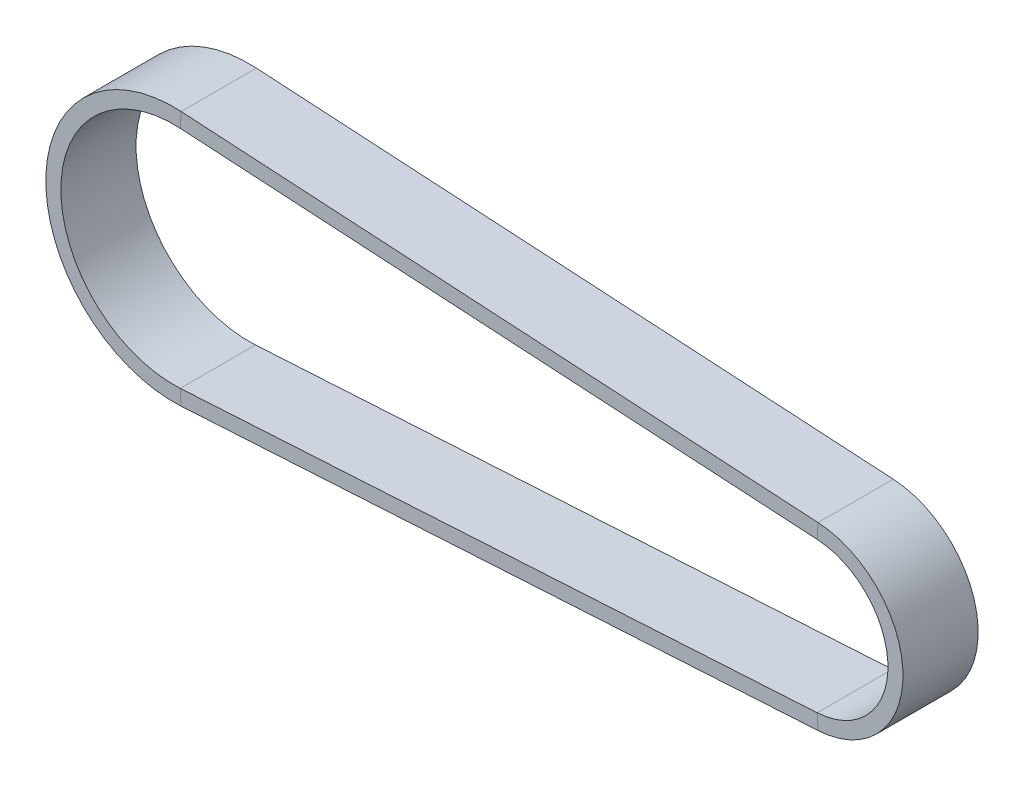
ISO-10303-21;
HEADER;
FILE_DESCRIPTION(('STEP AP214'),'2;1');
FILE_NAME('part.step','',(''),(''),'','','');
FILE_SCHEMA(('AUTOMOTIVE_DESIGN { 1 0 10303 214 1 1 1 1 }'));
ENDSEC;
DATA;
#1=APPLICATION_CONTEXT('core data for automotive mechanical design processes');
#2=APPLICATION_PROTOCOL_DEFINITION('international standard','automotive_design',2000,#1);
#3=PRODUCT_CONTEXT('',#1,'mechanical');
#4=PRODUCT('Part','Part','',(#3));
#5=PRODUCT_RELATED_PRODUCT_CATEGORY('part','',(#4));
#6=PRODUCT_DEFINITION_FORMATION('','',#4);
#7=PRODUCT_DEFINITION_CONTEXT('part definition',#1,'design');
#8=PRODUCT_DEFINITION('design','',#6,#7);
#9=PRODUCT_DEFINITION_SHAPE('','',#8);
#10=(LENGTH_UNIT() NAMED_UNIT(*) SI_UNIT(.MILLI.,.METRE.));
#11=(NAMED_UNIT(*) PLANE_ANGLE_UNIT() SI_UNIT($,.RADIAN.));
#12=(NAMED_UNIT(*) SI_UNIT($,.STERADIAN.) SOLID_ANGLE_UNIT());
#13=UNCERTAINTY_MEASURE_WITH_UNIT(LENGTH_MEASURE(1.E-05),#10,'distance_accuracy_value','');
#14=(GEOMETRIC_REPRESENTATION_CONTEXT(3) GLOBAL_UNCERTAINTY_ASSIGNED_CONTEXT((#13)) GLOBAL_UNIT_ASSIGNED_CONTEXT((#10,
#11,#12)) REPRESENTATION_CONTEXT('',''));
#15=CARTESIAN_POINT('',(0.,0.,0.));
#16=DIRECTION('',(0.,0.,1.));
#17=DIRECTION('',(1.,0.,0.));
#18=AXIS2_PLACEMENT_3D('',#15,#16,#17);
#19=CARTESIAN_POINT('',(85.,0.,15.5));
#20=DIRECTION('',(0.,0.,1.));
#21=DIRECTION('',(1.,0.,0.));
#22=AXIS2_PLACEMENT_3D('',#19,#20,#21);
#23=CYLINDRICAL_SURFACE('',#22,12.);
#24=CARTESIAN_POINT('',(85.,0.,20.5));
#25=DIRECTION('',(0.,0.,1.));
#26=DIRECTION('',(1.,0.,0.));
#27=AXIS2_PLACEMENT_3D('',#24,#25,#26);
#28=CIRCLE('',#27,12.);
#29=CARTESIAN_POINT('',(85.7058823529412,-11.9792207636309,20.5));
#30=VERTEX_POINT('',#29);
#31=CARTESIAN_POINT('',(85.7058823529412,11.9792207636309,20.5));
#32=VERTEX_POINT('',#31);
#33=EDGE_CURVE('E179',#30,#32,#28,.T.);
#34=ORIENTED_EDGE('',*,*,#33,.F.);
#35=DIRECTION('',(0.,0.,1.));
#36=VECTOR('',#35,1.);
#37=CARTESIAN_POINT('',(85.7058823529412,-11.9792207636309,10.5));
#38=LINE('',#37,#36);
#39=CARTESIAN_POINT('',(85.7058823529412,-11.9792207636309,10.5));
#40=VERTEX_POINT('',#39);
#41=EDGE_CURVE('E164',#40,#30,#38,.T.);
#42=ORIENTED_EDGE('',*,*,#41,.F.);
#43=CARTESIAN_POINT('',(85.,0.,10.5));
#44=DIRECTION('',(0.,0.,1.));
#45=DIRECTION('',(1.,0.,0.));
#46=AXIS2_PLACEMENT_3D('',#43,#44,#45);
#47=CIRCLE('',#46,12.);
#48=CARTESIAN_POINT('',(85.7058823529412,11.9792207636309,10.5));
#49=VERTEX_POINT('',#48);
#50=EDGE_CURVE('E142',#40,#49,#47,.T.);
#51=ORIENTED_EDGE('',*,*,#50,.T.);
#52=DIRECTION('',(0.,0.,1.));
#53=VECTOR('',#52,1.);
#54=CARTESIAN_POINT('',(85.7058823529412,11.9792207636309,10.5));
#55=LINE('',#54,#53);
#56=EDGE_CURVE('E154',#49,#32,#55,.T.);
#57=ORIENTED_EDGE('',*,*,#56,.T.);
#58=EDGE_LOOP('',(#34,#42,#51,#57));
#59=FACE_BOUND('',#58,.T.);
#60=ADVANCED_FACE('F47',(#59),#23,.T.);
#61=CARTESIAN_POINT('',(95.,0.,20.5));
#62=DIRECTION('',(0.,0.,-1.));
#63=DIRECTION('',(-1.,0.,0.));
#64=AXIS2_PLACEMENT_3D('',#61,#62,#63);
#65=PLANE('',#64);
#66=CARTESIAN_POINT('',(85.,0.,20.5));
#67=DIRECTION('',(0.,0.,1.));
#68=DIRECTION('',(1.,0.,0.));
#69=AXIS2_PLACEMENT_3D('',#66,#67,#68);
#70=CIRCLE('',#69,9.99999999999999);
#71=CARTESIAN_POINT('',(85.5882352941177,-9.98268396969243,20.5));
#72=VERTEX_POINT('',#71);
#73=CARTESIAN_POINT('',(85.5882352941177,9.98268396969243,20.5));
#74=VERTEX_POINT('',#73);
#75=EDGE_CURVE('E230',#72,#74,#70,.T.);
#76=ORIENTED_EDGE('',*,*,#75,.F.);
#77=DIRECTION('',(-0.0588235294117653,0.998268396969244,0.));
#78=VECTOR('',#77,1.);
#79=CARTESIAN_POINT('',(85.5882352941177,-9.98268396969243,20.5));
#80=LINE('',#79,#78);
#81=EDGE_CURVE('E182',#30,#72,#80,.T.);
#82=ORIENTED_EDGE('',*,*,#81,.F.);
#83=ORIENTED_EDGE('',*,*,#33,.T.);
#84=DIRECTION('',(-0.0588235294117653,-0.998268396969244,0.));
#85=VECTOR('',#84,1.);
#86=CARTESIAN_POINT('',(85.5882352941177,9.98268396969243,20.5));
#87=LINE('',#86,#85);
#88=EDGE_CURVE('E209',#32,#74,#87,.T.);
#89=ORIENTED_EDGE('',*,*,#88,.T.);
#90=EDGE_LOOP('',(#76,#82,#83,#89));
#91=FACE_BOUND('',#90,.T.);
#92=ADVANCED_FACE('F293',(#91),#65,.F.);
#93=CARTESIAN_POINT('',(85.,0.,15.5));
#94=DIRECTION('',(0.,0.,1.));
#95=DIRECTION('',(1.,0.,0.));
#96=AXIS2_PLACEMENT_3D('',#93,#94,#95);
#97=CYLINDRICAL_SURFACE('',#96,9.99999999999999);
#98=CARTESIAN_POINT('',(85.,0.,10.5));
#99=DIRECTION('',(0.,0.,1.));
#100=DIRECTION('',(1.,0.,0.));
#101=AXIS2_PLACEMENT_3D('',#98,#99,#100);
#102=CIRCLE('',#101,9.99999999999999);
#103=CARTESIAN_POINT('',(85.5882352941177,-9.98268396969243,10.5));
#104=VERTEX_POINT('',#103);
#105=CARTESIAN_POINT('',(85.5882352941177,9.98268396969243,10.5));
#106=VERTEX_POINT('',#105);
#107=EDGE_CURVE('E245',#104,#106,#102,.T.);
#108=ORIENTED_EDGE('',*,*,#107,.F.);
#109=DIRECTION('',(0.,0.,-1.));
#110=VECTOR('',#109,1.);
#111=CARTESIAN_POINT('',(85.5882352941177,-9.98268396969244,10.5));
#112=LINE('',#111,#110);
#113=EDGE_CURVE('E176',#72,#104,#112,.T.);
#114=ORIENTED_EDGE('',*,*,#113,.F.);
#115=ORIENTED_EDGE('',*,*,#75,.T.);
#116=DIRECTION('',(0.,0.,-1.));
#117=VECTOR('',#116,1.);
#118=CARTESIAN_POINT('',(85.5882352941177,9.98268396969244,10.5));
#119=LINE('',#118,#117);
#120=EDGE_CURVE('E234',#74,#106,#119,.T.);
#121=ORIENTED_EDGE('',*,*,#120,.T.);
#122=EDGE_LOOP('',(#108,#114,#115,#121));
#123=FACE_BOUND('',#122,.T.);
#124=ADVANCED_FACE('F269',(#123),#97,.F.);
#125=CARTESIAN_POINT('',(95.,0.,10.5));
#126=DIRECTION('',(0.,0.,1.));
#127=DIRECTION('',(1.,0.,0.));
#128=AXIS2_PLACEMENT_3D('',#125,#126,#127);
#129=PLANE('',#128);
#130=DIRECTION('',(0.0588235294117653,0.998268396969244,0.));
#131=VECTOR('',#130,1.);
#132=CARTESIAN_POINT('',(85.5882352941177,9.98268396969244,10.5));
#133=LINE('',#132,#131);
#134=EDGE_CURVE('E149',#106,#49,#133,.T.);
#135=ORIENTED_EDGE('',*,*,#134,.T.);
#136=ORIENTED_EDGE('',*,*,#50,.F.);
#137=DIRECTION('',(0.0588235294117653,-0.998268396969244,0.));
#138=VECTOR('',#137,1.);
#139=CARTESIAN_POINT('',(85.5882352941177,-9.98268396969244,10.5));
#140=LINE('',#139,#138);
#141=EDGE_CURVE('E147',#104,#40,#140,.T.);
#142=ORIENTED_EDGE('',*,*,#141,.F.);
#143=ORIENTED_EDGE('',*,*,#107,.T.);
#144=EDGE_LOOP('',(#135,#136,#142,#143));
#145=FACE_BOUND('',#144,.T.);
#146=ADVANCED_FACE('F144',(#145),#129,.F.);
#147=CARTESIAN_POINT('',(85.7058823529412,11.9792207636309,10.5));
#148=DIRECTION('',(-0.0588235294117647,-0.998268396969244,0.));
#149=DIRECTION('',(0.998268396969244,-0.0588235294117647,0.));
#150=AXIS2_PLACEMENT_3D('',#147,#148,#149);
#151=PLANE('',#150);
#152=DIRECTION('',(-0.998268396969244,0.0588235294117647,0.));
#153=VECTOR('',#152,1.);
#154=CARTESIAN_POINT('',(85.7058823529412,11.9792207636309,20.5));
#155=LINE('',#154,#153);
#156=CARTESIAN_POINT('',(1.00000000000001,16.9705627484771,20.5));
#157=VERTEX_POINT('',#156);
#158=EDGE_CURVE('E112',#32,#157,#155,.T.);
#159=ORIENTED_EDGE('',*,*,#158,.F.);
#160=ORIENTED_EDGE('',*,*,#56,.F.);
#161=DIRECTION('',(-0.998268396969244,0.0588235294117647,0.));
#162=VECTOR('',#161,1.);
#163=CARTESIAN_POINT('',(85.7058823529412,11.9792207636309,10.5));
#164=LINE('',#163,#162);
#165=CARTESIAN_POINT('',(1.00000000000001,16.9705627484771,10.5));
#166=VERTEX_POINT('',#165);
#167=EDGE_CURVE('E214',#49,#166,#164,.T.);
#168=ORIENTED_EDGE('',*,*,#167,.T.);
#169=DIRECTION('',(0.,0.,1.));
#170=VECTOR('',#169,1.);
#171=CARTESIAN_POINT('',(1.,16.9705627484771,10.5));
#172=LINE('',#171,#170);
#173=EDGE_CURVE('E211',#166,#157,#172,.T.);
#174=ORIENTED_EDGE('',*,*,#173,.T.);
#175=EDGE_LOOP('',(#159,#160,#168,#174));
#176=FACE_BOUND('',#175,.T.);
#177=ADVANCED_FACE('F260',(#176),#151,.F.);
#178=CARTESIAN_POINT('',(85.5882352941177,9.98268396969244,20.5));
#179=DIRECTION('',(0.,0.,-1.));
#180=DIRECTION('',(-1.,0.,0.));
#181=AXIS2_PLACEMENT_3D('',#178,#179,#180);
#182=PLANE('',#181);
#183=DIRECTION('',(-0.998268396969244,0.0588235294117647,0.));
#184=VECTOR('',#183,1.);
#185=CARTESIAN_POINT('',(85.5882352941177,9.98268396969244,20.5));
#186=LINE('',#185,#184);
#187=CARTESIAN_POINT('',(0.882352941176487,14.9740259545387,20.5));
#188=VERTEX_POINT('',#187);
#189=EDGE_CURVE('E103',#74,#188,#186,.T.);
#190=ORIENTED_EDGE('',*,*,#189,.F.);
#191=ORIENTED_EDGE('',*,*,#88,.F.);
#192=ORIENTED_EDGE('',*,*,#158,.T.);
#193=DIRECTION('',(-0.0588235294117647,-0.998268396969244,0.));
#194=VECTOR('',#193,1.);
#195=CARTESIAN_POINT('',(0.88235294117647,14.9740259545387,20.5));
#196=LINE('',#195,#194);
#197=EDGE_CURVE('E217',#157,#188,#196,.T.);
#198=ORIENTED_EDGE('',*,*,#197,.T.);
#199=EDGE_LOOP('',(#190,#191,#192,#198));
#200=FACE_BOUND('',#199,.T.);
#201=ADVANCED_FACE('F262',(#200),#182,.F.);
#202=CARTESIAN_POINT('',(85.5882352941177,9.98268396969244,10.5));
#203=DIRECTION('',(0.0588235294117647,0.998268396969244,0.));
#204=DIRECTION('',(-0.998268396969244,0.0588235294117647,0.));
#205=AXIS2_PLACEMENT_3D('',#202,#203,#204);
#206=PLANE('',#205);
#207=DIRECTION('',(-0.998268396969244,0.0588235294117647,0.));
#208=VECTOR('',#207,1.);
#209=CARTESIAN_POINT('',(85.5882352941177,9.98268396969244,10.5));
#210=LINE('',#209,#208);
#211=CARTESIAN_POINT('',(0.882352941176487,14.9740259545387,10.5));
#212=VERTEX_POINT('',#211);
#213=EDGE_CURVE('E90',#106,#212,#210,.T.);
#214=ORIENTED_EDGE('',*,*,#213,.F.);
#215=ORIENTED_EDGE('',*,*,#120,.F.);
#216=ORIENTED_EDGE('',*,*,#189,.T.);
#217=DIRECTION('',(0.,0.,-1.));
#218=VECTOR('',#217,1.);
#219=CARTESIAN_POINT('',(0.88235294117647,14.9740259545387,10.5));
#220=LINE('',#219,#218);
#221=EDGE_CURVE('E239',#188,#212,#220,.T.);
#222=ORIENTED_EDGE('',*,*,#221,.T.);
#223=EDGE_LOOP('',(#214,#215,#216,#222));
#224=FACE_BOUND('',#223,.T.);
#225=ADVANCED_FACE('F266',(#224),#206,.F.);
#226=CARTESIAN_POINT('',(85.5882352941177,9.98268396969244,10.5));
#227=DIRECTION('',(0.,0.,1.));
#228=DIRECTION('',(0.,-1.,0.));
#229=AXIS2_PLACEMENT_3D('',#226,#227,#228);
#230=PLANE('',#229);
#231=DIRECTION('',(0.0588235294117647,0.998268396969244,0.));
#232=VECTOR('',#231,1.);
#233=CARTESIAN_POINT('',(0.88235294117647,14.9740259545387,10.5));
#234=LINE('',#233,#232);
#235=EDGE_CURVE('E51',#212,#166,#234,.T.);
#236=ORIENTED_EDGE('',*,*,#235,.T.);
#237=ORIENTED_EDGE('',*,*,#167,.F.);
#238=ORIENTED_EDGE('',*,*,#134,.F.);
#239=ORIENTED_EDGE('',*,*,#213,.T.);
#240=EDGE_LOOP('',(#236,#237,#238,#239));
#241=FACE_BOUND('',#240,.T.);
#242=ADVANCED_FACE('F256',(#241),#230,.F.);
#243=CARTESIAN_POINT('',(0.,0.,15.5));
#244=DIRECTION('',(0.,0.,1.));
#245=DIRECTION('',(1.,0.,0.));
#246=AXIS2_PLACEMENT_3D('',#243,#244,#245);
#247=CYLINDRICAL_SURFACE('',#246,17.);
#248=CARTESIAN_POINT('',(0.,0.,20.5));
#249=DIRECTION('',(0.,0.,1.));
#250=DIRECTION('',(0.058823529411765,0.998268396969244,0.));
#251=AXIS2_PLACEMENT_3D('',#248,#249,#250);
#252=CIRCLE('',#251,17.);
#253=CARTESIAN_POINT('',(1.00000000000001,-16.9705627484771,20.5));
#254=VERTEX_POINT('',#253);
#255=EDGE_CURVE('E221',#157,#254,#252,.T.);
#256=ORIENTED_EDGE('',*,*,#255,.F.);
#257=ORIENTED_EDGE('',*,*,#173,.F.);
#258=CARTESIAN_POINT('',(0.,0.,10.5));
#259=DIRECTION('',(0.,0.,1.));
#260=DIRECTION('',(0.058823529411765,0.998268396969244,0.));
#261=AXIS2_PLACEMENT_3D('',#258,#259,#260);
#262=CIRCLE('',#261,17.);
#263=CARTESIAN_POINT('',(1.00000000000001,-16.9705627484771,10.5));
#264=VERTEX_POINT('',#263);
#265=EDGE_CURVE('E224',#166,#264,#262,.T.);
#266=ORIENTED_EDGE('',*,*,#265,.T.);
#267=DIRECTION('',(0.,0.,1.));
#268=VECTOR('',#267,1.);
#269=CARTESIAN_POINT('',(1.,-16.9705627484771,10.5));
#270=LINE('',#269,#268);
#271=EDGE_CURVE('E166',#264,#254,#270,.T.);
#272=ORIENTED_EDGE('',*,*,#271,.T.);
#273=EDGE_LOOP('',(#256,#257,#266,#272));
#274=FACE_BOUND('',#273,.T.);
#275=ADVANCED_FACE('F259',(#274),#247,.T.);
#276=CARTESIAN_POINT('',(0.882352941176474,14.9740259545387,20.5));
#277=DIRECTION('',(0.,0.,-1.));
#278=DIRECTION('',(-1.,0.,0.));
#279=AXIS2_PLACEMENT_3D('',#276,#277,#278);
#280=PLANE('',#279);
#281=CARTESIAN_POINT('',(0.,0.,20.5));
#282=DIRECTION('',(0.,0.,1.));
#283=DIRECTION('',(0.058823529411765,0.998268396969244,0.));
#284=AXIS2_PLACEMENT_3D('',#281,#282,#283);
#285=CIRCLE('',#284,15.);
#286=CARTESIAN_POINT('',(0.882352941176487,-14.9740259545387,20.5));
#287=VERTEX_POINT('',#286);
#288=EDGE_CURVE('E57',#188,#287,#285,.T.);
#289=ORIENTED_EDGE('',*,*,#288,.F.);
#290=ORIENTED_EDGE('',*,*,#197,.F.);
#291=ORIENTED_EDGE('',*,*,#255,.T.);
#292=DIRECTION('',(-0.0588235294117647,0.998268396969244,0.));
#293=VECTOR('',#292,1.);
#294=CARTESIAN_POINT('',(0.88235294117647,-14.9740259545387,20.5));
#295=LINE('',#294,#293);
#296=EDGE_CURVE('E193',#254,#287,#295,.T.);
#297=ORIENTED_EDGE('',*,*,#296,.T.);
#298=EDGE_LOOP('',(#289,#290,#291,#297));
#299=FACE_BOUND('',#298,.T.);
#300=ADVANCED_FACE('F281',(#299),#280,.F.);
#301=CARTESIAN_POINT('',(0.,0.,15.5));
#302=DIRECTION('',(0.,0.,1.));
#303=DIRECTION('',(1.,0.,0.));
#304=AXIS2_PLACEMENT_3D('',#301,#302,#303);
#305=CYLINDRICAL_SURFACE('',#304,15.);
#306=CARTESIAN_POINT('',(0.,0.,10.5));
#307=DIRECTION('',(0.,0.,1.));
#308=DIRECTION('',(0.058823529411765,0.998268396969244,0.));
#309=AXIS2_PLACEMENT_3D('',#306,#307,#308);
#310=CIRCLE('',#309,15.);
#311=CARTESIAN_POINT('',(0.882352941176487,-14.9740259545387,10.5));
#312=VERTEX_POINT('',#311);
#313=EDGE_CURVE('E11',#212,#312,#310,.T.);
#314=ORIENTED_EDGE('',*,*,#313,.F.);
#315=ORIENTED_EDGE('',*,*,#221,.F.);
#316=ORIENTED_EDGE('',*,*,#288,.T.);
#317=DIRECTION('',(0.,0.,-1.));
#318=VECTOR('',#317,1.);
#319=CARTESIAN_POINT('',(0.88235294117647,-14.9740259545387,10.5));
#320=LINE('',#319,#318);
#321=EDGE_CURVE('E199',#287,#312,#320,.T.);
#322=ORIENTED_EDGE('',*,*,#321,.T.);
#323=EDGE_LOOP('',(#314,#315,#316,#322));
#324=FACE_BOUND('',#323,.T.);
#325=ADVANCED_FACE('F274',(#324),#305,.F.);
#326=CARTESIAN_POINT('',(0.882352941176474,14.9740259545387,10.5));
#327=DIRECTION('',(0.,0.,1.));
#328=DIRECTION('',(1.,0.,0.));
#329=AXIS2_PLACEMENT_3D('',#326,#327,#328);
#330=PLANE('',#329);
#331=ORIENTED_EDGE('',*,*,#313,.T.);
#332=DIRECTION('',(0.0588235294117647,-0.998268396969244,0.));
#333=VECTOR('',#332,1.);
#334=CARTESIAN_POINT('',(0.88235294117647,-14.9740259545387,10.5));
#335=LINE('',#334,#333);
#336=EDGE_CURVE('E155',#312,#264,#335,.T.);
#337=ORIENTED_EDGE('',*,*,#336,.T.);
#338=ORIENTED_EDGE('',*,*,#265,.F.);
#339=ORIENTED_EDGE('',*,*,#235,.F.);
#340=EDGE_LOOP('',(#331,#337,#338,#339));
#341=FACE_BOUND('',#340,.T.);
#342=ADVANCED_FACE('F49',(#341),#330,.F.);
#343=CARTESIAN_POINT('',(85.7058823529412,-11.9792207636309,10.5));
#344=DIRECTION('',(-0.0588235294117647,0.998268396969244,0.));
#345=DIRECTION('',(0.998268396969244,0.0588235294117647,0.));
#346=AXIS2_PLACEMENT_3D('',#343,#344,#345);
#347=PLANE('',#346);
#348=DIRECTION('',(-0.998268396969244,-0.0588235294117647,0.));
#349=VECTOR('',#348,1.);
#350=CARTESIAN_POINT('',(85.7058823529412,-11.9792207636309,20.5));
#351=LINE('',#350,#349);
#352=EDGE_CURVE('E191',#30,#254,#351,.T.);
#353=ORIENTED_EDGE('',*,*,#352,.T.);
#354=ORIENTED_EDGE('',*,*,#271,.F.);
#355=DIRECTION('',(-0.998268396969244,-0.0588235294117647,0.));
#356=VECTOR('',#355,1.);
#357=CARTESIAN_POINT('',(85.7058823529412,-11.9792207636309,10.5));
#358=LINE('',#357,#356);
#359=EDGE_CURVE('E161',#40,#264,#358,.T.);
#360=ORIENTED_EDGE('',*,*,#359,.F.);
#361=ORIENTED_EDGE('',*,*,#41,.T.);
#362=EDGE_LOOP('',(#353,#354,#360,#361));
#363=FACE_BOUND('',#362,.T.);
#364=ADVANCED_FACE('F163',(#363),#347,.F.);
#365=CARTESIAN_POINT('',(85.5882352941177,-9.98268396969244,20.5));
#366=DIRECTION('',(0.,0.,-1.));
#367=DIRECTION('',(-1.,0.,0.));
#368=AXIS2_PLACEMENT_3D('',#365,#366,#367);
#369=PLANE('',#368);
#370=DIRECTION('',(-0.998268396969244,-0.0588235294117647,0.));
#371=VECTOR('',#370,1.);
#372=CARTESIAN_POINT('',(85.5882352941177,-9.98268396969244,20.5));
#373=LINE('',#372,#371);
#374=EDGE_CURVE('E196',#72,#287,#373,.T.);
#375=ORIENTED_EDGE('',*,*,#374,.T.);
#376=ORIENTED_EDGE('',*,*,#296,.F.);
#377=ORIENTED_EDGE('',*,*,#352,.F.);
#378=ORIENTED_EDGE('',*,*,#81,.T.);
#379=EDGE_LOOP('',(#375,#376,#377,#378));
#380=FACE_BOUND('',#379,.T.);
#381=ADVANCED_FACE('F279',(#380),#369,.F.);
#382=CARTESIAN_POINT('',(85.5882352941177,-9.98268396969244,10.5));
#383=DIRECTION('',(0.0588235294117647,-0.998268396969244,0.));
#384=DIRECTION('',(-0.998268396969244,-0.0588235294117647,0.));
#385=AXIS2_PLACEMENT_3D('',#382,#383,#384);
#386=PLANE('',#385);
#387=DIRECTION('',(-0.998268396969244,-0.0588235294117647,0.));
#388=VECTOR('',#387,1.);
#389=CARTESIAN_POINT('',(85.5882352941177,-9.98268396969244,10.5));
#390=LINE('',#389,#388);
#391=EDGE_CURVE('E174',#104,#312,#390,.T.);
#392=ORIENTED_EDGE('',*,*,#391,.T.);
#393=ORIENTED_EDGE('',*,*,#321,.F.);
#394=ORIENTED_EDGE('',*,*,#374,.F.);
#395=ORIENTED_EDGE('',*,*,#113,.T.);
#396=EDGE_LOOP('',(#392,#393,#394,#395));
#397=FACE_BOUND('',#396,.T.);
#398=ADVANCED_FACE('F286',(#397),#386,.F.);
#399=CARTESIAN_POINT('',(85.5882352941177,-9.98268396969244,10.5));
#400=DIRECTION('',(0.,0.,1.));
#401=DIRECTION('',(0.,1.,0.));
#402=AXIS2_PLACEMENT_3D('',#399,#400,#401);
#403=PLANE('',#402);
#404=ORIENTED_EDGE('',*,*,#336,.F.);
#405=ORIENTED_EDGE('',*,*,#391,.F.);
#406=ORIENTED_EDGE('',*,*,#141,.T.);
#407=ORIENTED_EDGE('',*,*,#359,.T.);
#408=EDGE_LOOP('',(#404,#405,#406,#407));
#409=FACE_BOUND('',#408,.T.);
#410=ADVANCED_FACE('F172',(#409),#403,.F.);
#411=CLOSED_SHELL('',(#60,#92,#124,#146,#177,#201,#225,#242,#275,#300,#325,#342,#364,#381,#398,#410));
#412=MANIFOLD_SOLID_BREP('B2',#411);
#413=ADVANCED_BREP_SHAPE_REPRESENTATION('',(#18,#412),#14);
#414=SHAPE_DEFINITION_REPRESENTATION(#9,#413);
ENDSEC;
END-ISO-10303-21;
